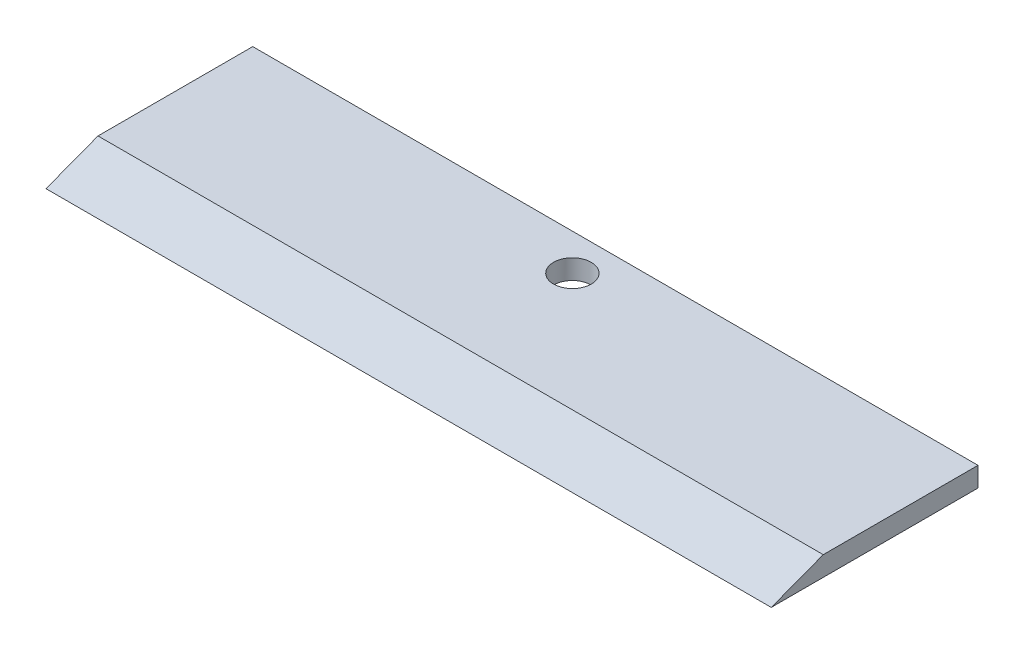
ISO-10303-21;
HEADER;
FILE_DESCRIPTION(('STEP AP214'),'2;1');
FILE_NAME('part.step','',(''),(''),'','','');
FILE_SCHEMA(('AUTOMOTIVE_DESIGN { 1 0 10303 214 1 1 1 1 }'));
ENDSEC;
DATA;
#1=APPLICATION_CONTEXT('core data for automotive mechanical design processes');
#2=APPLICATION_PROTOCOL_DEFINITION('international standard','automotive_design',2000,#1);
#3=PRODUCT_CONTEXT('',#1,'mechanical');
#4=PRODUCT('Part','Part','',(#3));
#5=PRODUCT_RELATED_PRODUCT_CATEGORY('part','',(#4));
#6=PRODUCT_DEFINITION_FORMATION('','',#4);
#7=PRODUCT_DEFINITION_CONTEXT('part definition',#1,'design');
#8=PRODUCT_DEFINITION('design','',#6,#7);
#9=PRODUCT_DEFINITION_SHAPE('','',#8);
#10=(LENGTH_UNIT() NAMED_UNIT(*) SI_UNIT(.MILLI.,.METRE.));
#11=(NAMED_UNIT(*) PLANE_ANGLE_UNIT() SI_UNIT($,.RADIAN.));
#12=(NAMED_UNIT(*) SI_UNIT($,.STERADIAN.) SOLID_ANGLE_UNIT());
#13=UNCERTAINTY_MEASURE_WITH_UNIT(LENGTH_MEASURE(1.E-05),#10,'distance_accuracy_value','');
#14=(GEOMETRIC_REPRESENTATION_CONTEXT(3) GLOBAL_UNCERTAINTY_ASSIGNED_CONTEXT((#13)) GLOBAL_UNIT_ASSIGNED_CONTEXT((#10,
#11,#12)) REPRESENTATION_CONTEXT('',''));
#15=CARTESIAN_POINT('',(0.,0.,0.));
#16=DIRECTION('',(0.,0.,1.));
#17=DIRECTION('',(1.,0.,0.));
#18=AXIS2_PLACEMENT_3D('',#15,#16,#17);
#19=CARTESIAN_POINT('',(0.,0.6,0.));
#20=DIRECTION('',(1.,0.,0.));
#21=DIRECTION('',(0.,0.,-1.));
#22=AXIS2_PLACEMENT_3D('',#19,#20,#21);
#23=PLANE('',#22);
#24=DIRECTION('',(0.,0.,1.));
#25=VECTOR('',#24,1.);
#26=CARTESIAN_POINT('',(0.,0.,0.));
#27=LINE('',#26,#25);
#28=CARTESIAN_POINT('',(0.,0.,-6.3));
#29=VERTEX_POINT('',#28);
#30=CARTESIAN_POINT('',(0.,0.,0.));
#31=VERTEX_POINT('',#30);
#32=EDGE_CURVE('E85',#29,#31,#27,.T.);
#33=ORIENTED_EDGE('',*,*,#32,.T.);
#34=DIRECTION('',(0.,0.35413346383953,-0.935194894013551));
#35=VECTOR('',#34,1.);
#36=CARTESIAN_POINT('',(0.,0.0752463061265903,-0.198710284309237));
#37=LINE('',#36,#35);
#38=CARTESIAN_POINT('',(0.,0.6,-1.58447871693479));
#39=VERTEX_POINT('',#38);
#40=EDGE_CURVE('E91',#31,#39,#37,.T.);
#41=ORIENTED_EDGE('',*,*,#40,.T.);
#42=DIRECTION('',(0.,0.,1.));
#43=VECTOR('',#42,1.);
#44=CARTESIAN_POINT('',(0.,0.6,0.));
#45=LINE('',#44,#43);
#46=CARTESIAN_POINT('',(0.,0.6,-6.3));
#47=VERTEX_POINT('',#46);
#48=EDGE_CURVE('E80',#47,#39,#45,.T.);
#49=ORIENTED_EDGE('',*,*,#48,.F.);
#50=DIRECTION('',(0.,-1.,0.));
#51=VECTOR('',#50,1.);
#52=CARTESIAN_POINT('',(0.,0.6,-6.3));
#53=LINE('',#52,#51);
#54=EDGE_CURVE('E48',#47,#29,#53,.T.);
#55=ORIENTED_EDGE('',*,*,#54,.T.);
#56=EDGE_LOOP('',(#33,#41,#49,#55));
#57=FACE_BOUND('',#56,.T.);
#58=ADVANCED_FACE('F39',(#57),#23,.F.);
#59=CARTESIAN_POINT('',(22.1,0.6,0.));
#60=DIRECTION('',(-1.,0.,0.));
#61=DIRECTION('',(0.,0.,1.));
#62=AXIS2_PLACEMENT_3D('',#59,#60,#61);
#63=PLANE('',#62);
#64=DIRECTION('',(0.,0.,-1.));
#65=VECTOR('',#64,1.);
#66=CARTESIAN_POINT('',(22.1,0.6,0.));
#67=LINE('',#66,#65);
#68=CARTESIAN_POINT('',(22.1,0.6,-1.58447871693479));
#69=VERTEX_POINT('',#68);
#70=CARTESIAN_POINT('',(22.1,0.6,-6.3));
#71=VERTEX_POINT('',#70);
#72=EDGE_CURVE('E99',#69,#71,#67,.T.);
#73=ORIENTED_EDGE('',*,*,#72,.F.);
#74=DIRECTION('',(0.,0.35413346383953,-0.935194894013551));
#75=VECTOR('',#74,1.);
#76=CARTESIAN_POINT('',(22.1,0.,0.));
#77=LINE('',#76,#75);
#78=CARTESIAN_POINT('',(22.1,0.,0.));
#79=VERTEX_POINT('',#78);
#80=EDGE_CURVE('E104',#79,#69,#77,.T.);
#81=ORIENTED_EDGE('',*,*,#80,.F.);
#82=DIRECTION('',(0.,0.,-1.));
#83=VECTOR('',#82,1.);
#84=CARTESIAN_POINT('',(22.1,0.,0.));
#85=LINE('',#84,#83);
#86=CARTESIAN_POINT('',(22.1,0.,-6.3));
#87=VERTEX_POINT('',#86);
#88=EDGE_CURVE('E70',#79,#87,#85,.T.);
#89=ORIENTED_EDGE('',*,*,#88,.T.);
#90=DIRECTION('',(0.,-1.,0.));
#91=VECTOR('',#90,1.);
#92=CARTESIAN_POINT('',(22.1,0.6,-6.3));
#93=LINE('',#92,#91);
#94=EDGE_CURVE('E11',#71,#87,#93,.T.);
#95=ORIENTED_EDGE('',*,*,#94,.F.);
#96=EDGE_LOOP('',(#73,#81,#89,#95));
#97=FACE_BOUND('',#96,.T.);
#98=ADVANCED_FACE('F131',(#97),#63,.F.);
#99=CARTESIAN_POINT('',(0.,0.6,-6.3));
#100=DIRECTION('',(0.,0.,1.));
#101=DIRECTION('',(1.,0.,0.));
#102=AXIS2_PLACEMENT_3D('',#99,#100,#101);
#103=PLANE('',#102);
#104=DIRECTION('',(-1.,0.,0.));
#105=VECTOR('',#104,1.);
#106=CARTESIAN_POINT('',(0.,0.,-6.3));
#107=LINE('',#106,#105);
#108=EDGE_CURVE('E74',#87,#29,#107,.T.);
#109=ORIENTED_EDGE('',*,*,#108,.T.);
#110=ORIENTED_EDGE('',*,*,#54,.F.);
#111=DIRECTION('',(-1.,0.,0.));
#112=VECTOR('',#111,1.);
#113=CARTESIAN_POINT('',(0.,0.6,-6.3));
#114=LINE('',#113,#112);
#115=EDGE_CURVE('E56',#71,#47,#114,.T.);
#116=ORIENTED_EDGE('',*,*,#115,.F.);
#117=ORIENTED_EDGE('',*,*,#94,.T.);
#118=EDGE_LOOP('',(#109,#110,#116,#117));
#119=FACE_BOUND('',#118,.T.);
#120=ADVANCED_FACE('F76',(#119),#103,.F.);
#121=CARTESIAN_POINT('',(0.,0.6,0.));
#122=DIRECTION('',(0.,-1.,0.));
#123=DIRECTION('',(0.,0.,-1.));
#124=AXIS2_PLACEMENT_3D('',#121,#122,#123);
#125=PLANE('',#124);
#126=CARTESIAN_POINT('',(10.85,0.6,-5.18990929174482));
#127=DIRECTION('',(0.,1.,0.));
#128=DIRECTION('',(0.,0.,1.));
#129=AXIS2_PLACEMENT_3D('',#126,#127,#128);
#130=CIRCLE('',#129,0.575);
#131=CARTESIAN_POINT('',(10.85,0.6,-4.61490929174482));
#132=VERTEX_POINT('',#131);
#133=EDGE_CURVE('E107',#132,#132,#130,.T.);
#134=ORIENTED_EDGE('',*,*,#133,.F.);
#135=EDGE_LOOP('',(#134));
#136=FACE_BOUND('',#135,.T.);
#137=ORIENTED_EDGE('',*,*,#48,.T.);
#138=DIRECTION('',(1.,0.,0.));
#139=VECTOR('',#138,1.);
#140=CARTESIAN_POINT('',(-2.63,0.6,-1.58447871693479));
#141=LINE('',#140,#139);
#142=EDGE_CURVE('E94',#39,#69,#141,.T.);
#143=ORIENTED_EDGE('',*,*,#142,.T.);
#144=ORIENTED_EDGE('',*,*,#72,.T.);
#145=ORIENTED_EDGE('',*,*,#115,.T.);
#146=EDGE_LOOP('',(#137,#143,#144,#145));
#147=FACE_BOUND('',#146,.T.);
#148=ADVANCED_FACE('F118',(#136,#147),#125,.F.);
#149=CARTESIAN_POINT('',(0.,0.,0.));
#150=DIRECTION('',(0.,-1.,0.));
#151=DIRECTION('',(0.,0.,-1.));
#152=AXIS2_PLACEMENT_3D('',#149,#150,#151);
#153=PLANE('',#152);
#154=CARTESIAN_POINT('',(10.85,0.,-5.18990929174482));
#155=DIRECTION('',(0.,-1.,0.));
#156=DIRECTION('',(0.,0.,-1.));
#157=AXIS2_PLACEMENT_3D('',#154,#155,#156);
#158=CIRCLE('',#157,0.575);
#159=CARTESIAN_POINT('',(10.85,0.,-5.76490929174482));
#160=VERTEX_POINT('',#159);
#161=EDGE_CURVE('E42',#160,#160,#158,.T.);
#162=ORIENTED_EDGE('',*,*,#161,.F.);
#163=EDGE_LOOP('',(#162));
#164=FACE_BOUND('',#163,.T.);
#165=ORIENTED_EDGE('',*,*,#32,.F.);
#166=ORIENTED_EDGE('',*,*,#108,.F.);
#167=ORIENTED_EDGE('',*,*,#88,.F.);
#168=DIRECTION('',(1.,0.,0.));
#169=VECTOR('',#168,1.);
#170=CARTESIAN_POINT('',(0.,0.,0.));
#171=LINE('',#170,#169);
#172=EDGE_CURVE('E90',#31,#79,#171,.T.);
#173=ORIENTED_EDGE('',*,*,#172,.F.);
#174=EDGE_LOOP('',(#165,#166,#167,#173));
#175=FACE_BOUND('',#174,.T.);
#176=ADVANCED_FACE('F88',(#164,#175),#153,.T.);
#177=CARTESIAN_POINT('',(-2.63,0.,0.));
#178=DIRECTION('',(0.,-0.93519489401355,-0.35413346383953));
#179=DIRECTION('',(0.,0.35413346383953,-0.935194894013551));
#180=AXIS2_PLACEMENT_3D('',#177,#178,#179);
#181=PLANE('',#180);
#182=ORIENTED_EDGE('',*,*,#172,.T.);
#183=ORIENTED_EDGE('',*,*,#80,.T.);
#184=ORIENTED_EDGE('',*,*,#142,.F.);
#185=ORIENTED_EDGE('',*,*,#40,.F.);
#186=EDGE_LOOP('',(#182,#183,#184,#185));
#187=FACE_BOUND('',#186,.T.);
#188=ADVANCED_FACE('F117',(#187),#181,.F.);
#189=CARTESIAN_POINT('',(10.85,-1.94,-5.18990929174482));
#190=DIRECTION('',(0.,1.,0.));
#191=DIRECTION('',(0.,0.,1.));
#192=AXIS2_PLACEMENT_3D('',#189,#190,#191);
#193=CYLINDRICAL_SURFACE('',#192,0.575);
#194=ORIENTED_EDGE('',*,*,#161,.T.);
#195=EDGE_LOOP('',(#194));
#196=FACE_BOUND('',#195,.T.);
#197=ORIENTED_EDGE('',*,*,#133,.T.);
#198=EDGE_LOOP('',(#197));
#199=FACE_BOUND('',#198,.T.);
#200=ADVANCED_FACE('F114',(#196,#199),#193,.F.);
#201=CLOSED_SHELL('',(#58,#98,#120,#148,#176,#188,#200));
#202=MANIFOLD_SOLID_BREP('B2',#201);
#203=ADVANCED_BREP_SHAPE_REPRESENTATION('',(#18,#202),#14);
#204=SHAPE_DEFINITION_REPRESENTATION(#9,#203);
ENDSEC;
END-ISO-10303-21;
